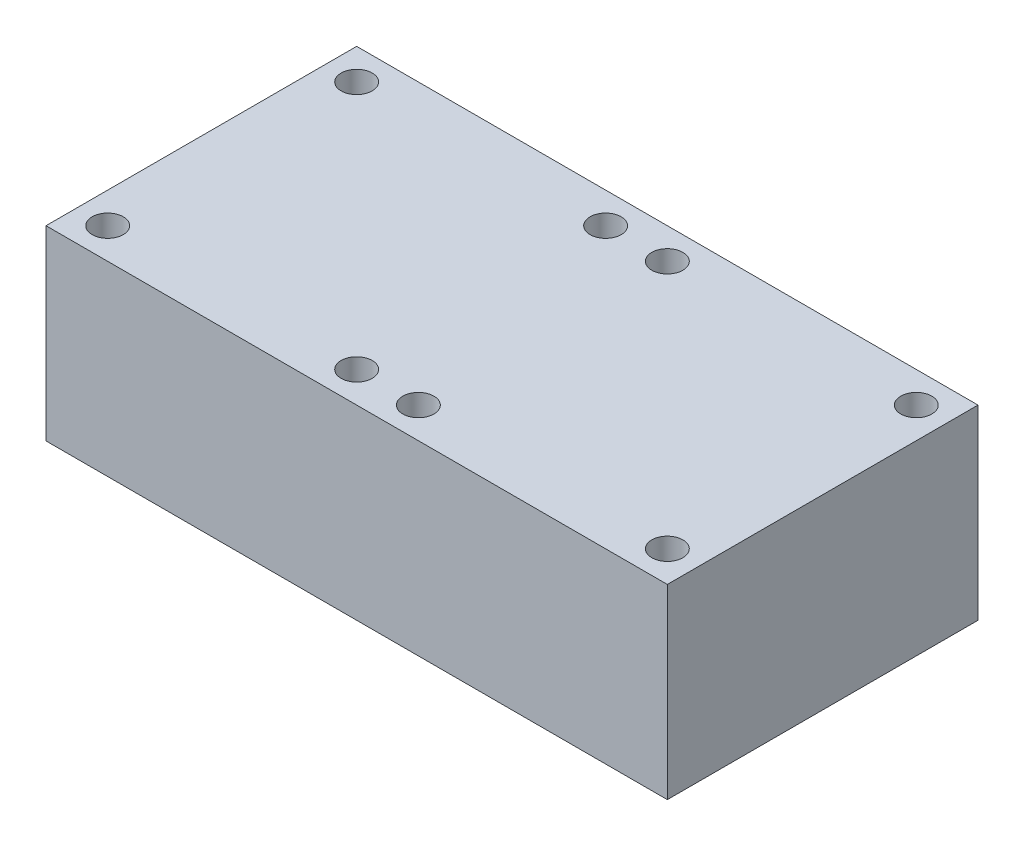
ISO-10303-21;
HEADER;
FILE_DESCRIPTION(('STEP AP214'),'2;1');
FILE_NAME('part.step','',(''),(''),'','','');
FILE_SCHEMA(('AUTOMOTIVE_DESIGN { 1 0 10303 214 1 1 1 1 }'));
ENDSEC;
DATA;
#1=APPLICATION_CONTEXT('core data for automotive mechanical design processes');
#2=APPLICATION_PROTOCOL_DEFINITION('international standard','automotive_design',2000,#1);
#3=PRODUCT_CONTEXT('',#1,'mechanical');
#4=PRODUCT('Part','Part','',(#3));
#5=PRODUCT_RELATED_PRODUCT_CATEGORY('part','',(#4));
#6=PRODUCT_DEFINITION_FORMATION('','',#4);
#7=PRODUCT_DEFINITION_CONTEXT('part definition',#1,'design');
#8=PRODUCT_DEFINITION('design','',#6,#7);
#9=PRODUCT_DEFINITION_SHAPE('','',#8);
#10=(LENGTH_UNIT() NAMED_UNIT(*) SI_UNIT(.MILLI.,.METRE.));
#11=(NAMED_UNIT(*) PLANE_ANGLE_UNIT() SI_UNIT($,.RADIAN.));
#12=(NAMED_UNIT(*) SI_UNIT($,.STERADIAN.) SOLID_ANGLE_UNIT());
#13=UNCERTAINTY_MEASURE_WITH_UNIT(LENGTH_MEASURE(1.E-05),#10,'distance_accuracy_value','');
#14=(GEOMETRIC_REPRESENTATION_CONTEXT(3) GLOBAL_UNCERTAINTY_ASSIGNED_CONTEXT((#13)) GLOBAL_UNIT_ASSIGNED_CONTEXT((#10,
#11,#12)) REPRESENTATION_CONTEXT('',''));
#15=CARTESIAN_POINT('',(0.,0.,0.));
#16=DIRECTION('',(0.,0.,1.));
#17=DIRECTION('',(1.,0.,0.));
#18=AXIS2_PLACEMENT_3D('',#15,#16,#17);
#19=CARTESIAN_POINT('',(30.,-15.,30.));
#20=DIRECTION('',(-1.,0.,0.));
#21=DIRECTION('',(0.,0.,1.));
#22=AXIS2_PLACEMENT_3D('',#19,#20,#21);
#23=PLANE('',#22);
#24=DIRECTION('',(0.,0.,1.));
#25=VECTOR('',#24,1.);
#26=CARTESIAN_POINT('',(30.,-3.,0.));
#27=LINE('',#26,#25);
#28=CARTESIAN_POINT('',(30.,-3.,0.));
#29=VERTEX_POINT('',#28);
#30=CARTESIAN_POINT('',(30.,-3.,30.));
#31=VERTEX_POINT('',#30);
#32=EDGE_CURVE('E97',#29,#31,#27,.T.);
#33=ORIENTED_EDGE('',*,*,#32,.F.);
#34=DIRECTION('',(0.,1.,0.));
#35=VECTOR('',#34,1.);
#36=CARTESIAN_POINT('',(30.,-15.,0.));
#37=LINE('',#36,#35);
#38=CARTESIAN_POINT('',(30.,15.,0.));
#39=VERTEX_POINT('',#38);
#40=EDGE_CURVE('E80',#29,#39,#37,.T.);
#41=ORIENTED_EDGE('',*,*,#40,.T.);
#42=DIRECTION('',(0.,0.,-1.));
#43=VECTOR('',#42,1.);
#44=CARTESIAN_POINT('',(30.,15.,30.));
#45=LINE('',#44,#43);
#46=CARTESIAN_POINT('',(30.,15.,30.));
#47=VERTEX_POINT('',#46);
#48=EDGE_CURVE('E11',#47,#39,#45,.T.);
#49=ORIENTED_EDGE('',*,*,#48,.F.);
#50=DIRECTION('',(0.,1.,0.));
#51=VECTOR('',#50,1.);
#52=CARTESIAN_POINT('',(30.,-15.,30.));
#53=LINE('',#52,#51);
#54=EDGE_CURVE('E88',#31,#47,#53,.T.);
#55=ORIENTED_EDGE('',*,*,#54,.F.);
#56=EDGE_LOOP('',(#33,#41,#49,#55));
#57=FACE_BOUND('',#56,.T.);
#58=ADVANCED_FACE('F36',(#57),#23,.F.);
#59=CARTESIAN_POINT('',(-30.,-15.,30.));
#60=DIRECTION('',(1.,0.,0.));
#61=DIRECTION('',(0.,0.,-1.));
#62=AXIS2_PLACEMENT_3D('',#59,#60,#61);
#63=PLANE('',#62);
#64=DIRECTION('',(0.,0.,-1.));
#65=VECTOR('',#64,1.);
#66=CARTESIAN_POINT('',(-30.,-3.,30.));
#67=LINE('',#66,#65);
#68=CARTESIAN_POINT('',(-30.,-3.,30.));
#69=VERTEX_POINT('',#68);
#70=CARTESIAN_POINT('',(-30.,-3.,0.));
#71=VERTEX_POINT('',#70);
#72=EDGE_CURVE('E50',#69,#71,#67,.T.);
#73=ORIENTED_EDGE('',*,*,#72,.F.);
#74=DIRECTION('',(0.,-1.,0.));
#75=VECTOR('',#74,1.);
#76=CARTESIAN_POINT('',(-30.,-15.,30.));
#77=LINE('',#76,#75);
#78=CARTESIAN_POINT('',(-30.,15.,30.));
#79=VERTEX_POINT('',#78);
#80=EDGE_CURVE('E85',#79,#69,#77,.T.);
#81=ORIENTED_EDGE('',*,*,#80,.F.);
#82=DIRECTION('',(0.,0.,-1.));
#83=VECTOR('',#82,1.);
#84=CARTESIAN_POINT('',(-30.,15.,30.));
#85=LINE('',#84,#83);
#86=CARTESIAN_POINT('',(-30.,15.,0.));
#87=VERTEX_POINT('',#86);
#88=EDGE_CURVE('E43',#79,#87,#85,.T.);
#89=ORIENTED_EDGE('',*,*,#88,.T.);
#90=DIRECTION('',(0.,-1.,0.));
#91=VECTOR('',#90,1.);
#92=CARTESIAN_POINT('',(-30.,-15.,0.));
#93=LINE('',#92,#91);
#94=EDGE_CURVE('E79',#87,#71,#93,.T.);
#95=ORIENTED_EDGE('',*,*,#94,.T.);
#96=EDGE_LOOP('',(#73,#81,#89,#95));
#97=FACE_BOUND('',#96,.T.);
#98=ADVANCED_FACE('F84',(#97),#63,.F.);
#99=CARTESIAN_POINT('',(0.,0.,30.));
#100=DIRECTION('',(0.,0.,-1.));
#101=DIRECTION('',(-1.,0.,0.));
#102=AXIS2_PLACEMENT_3D('',#99,#100,#101);
#103=PLANE('',#102);
#104=DIRECTION('',(-1.,0.,0.));
#105=VECTOR('',#104,1.);
#106=CARTESIAN_POINT('',(30.,-3.,30.));
#107=LINE('',#106,#105);
#108=EDGE_CURVE('E93',#31,#69,#107,.T.);
#109=ORIENTED_EDGE('',*,*,#108,.F.);
#110=ORIENTED_EDGE('',*,*,#54,.T.);
#111=DIRECTION('',(-1.,0.,0.));
#112=VECTOR('',#111,1.);
#113=CARTESIAN_POINT('',(-30.,15.,30.));
#114=LINE('',#113,#112);
#115=EDGE_CURVE('E59',#47,#79,#114,.T.);
#116=ORIENTED_EDGE('',*,*,#115,.T.);
#117=ORIENTED_EDGE('',*,*,#80,.T.);
#118=EDGE_LOOP('',(#109,#110,#116,#117));
#119=FACE_BOUND('',#118,.T.);
#120=ADVANCED_FACE('F191',(#119),#103,.F.);
#121=CARTESIAN_POINT('',(0.,0.,0.));
#122=DIRECTION('',(0.,0.,-1.));
#123=DIRECTION('',(-1.,0.,0.));
#124=AXIS2_PLACEMENT_3D('',#121,#122,#123);
#125=PLANE('',#124);
#126=ORIENTED_EDGE('',*,*,#40,.F.);
#127=DIRECTION('',(1.,0.,0.));
#128=VECTOR('',#127,1.);
#129=CARTESIAN_POINT('',(-30.,-3.,0.));
#130=LINE('',#129,#128);
#131=EDGE_CURVE('E87',#71,#29,#130,.T.);
#132=ORIENTED_EDGE('',*,*,#131,.F.);
#133=ORIENTED_EDGE('',*,*,#94,.F.);
#134=DIRECTION('',(-1.,0.,0.));
#135=VECTOR('',#134,1.);
#136=CARTESIAN_POINT('',(-30.,15.,0.));
#137=LINE('',#136,#135);
#138=EDGE_CURVE('E71',#39,#87,#137,.T.);
#139=ORIENTED_EDGE('',*,*,#138,.F.);
#140=EDGE_LOOP('',(#126,#132,#133,#139));
#141=FACE_BOUND('',#140,.T.);
#142=ADVANCED_FACE('F86',(#141),#125,.T.);
#143=CARTESIAN_POINT('',(-30.,15.,30.));
#144=DIRECTION('',(0.,-1.,0.));
#145=DIRECTION('',(0.,0.,-1.));
#146=AXIS2_PLACEMENT_3D('',#143,#144,#145);
#147=PLANE('',#146);
#148=CARTESIAN_POINT('',(27.0208152801713,15.,27.0208152801713));
#149=DIRECTION('',(0.,1.,0.));
#150=DIRECTION('',(0.,0.,-1.));
#151=AXIS2_PLACEMENT_3D('',#148,#149,#150);
#152=CIRCLE('',#151,1.5);
#153=CARTESIAN_POINT('',(27.0208152801713,15.,25.5208152801713));
#154=VERTEX_POINT('',#153);
#155=EDGE_CURVE('E121',#154,#154,#152,.T.);
#156=ORIENTED_EDGE('',*,*,#155,.F.);
#157=EDGE_LOOP('',(#156));
#158=FACE_BOUND('',#157,.T.);
#159=CARTESIAN_POINT('',(-27.0208152801713,15.,27.0208152801713));
#160=DIRECTION('',(0.,1.,0.));
#161=DIRECTION('',(0.,0.,1.));
#162=AXIS2_PLACEMENT_3D('',#159,#160,#161);
#163=CIRCLE('',#162,1.5);
#164=CARTESIAN_POINT('',(-27.0208152801713,15.,28.5208152801713));
#165=VERTEX_POINT('',#164);
#166=EDGE_CURVE('E128',#165,#165,#163,.T.);
#167=ORIENTED_EDGE('',*,*,#166,.F.);
#168=EDGE_LOOP('',(#167));
#169=FACE_BOUND('',#168,.T.);
#170=CARTESIAN_POINT('',(-2.97918471982869,15.,27.0208152801713));
#171=DIRECTION('',(0.,1.,0.));
#172=DIRECTION('',(0.,0.,1.));
#173=AXIS2_PLACEMENT_3D('',#170,#171,#172);
#174=CIRCLE('',#173,1.5);
#175=CARTESIAN_POINT('',(-2.97918471982869,15.,28.5208152801713));
#176=VERTEX_POINT('',#175);
#177=EDGE_CURVE('E109',#176,#176,#174,.T.);
#178=ORIENTED_EDGE('',*,*,#177,.F.);
#179=EDGE_LOOP('',(#178));
#180=FACE_BOUND('',#179,.T.);
#181=CARTESIAN_POINT('',(-2.97918471982869,15.,2.97918471982869));
#182=DIRECTION('',(0.,1.,0.));
#183=DIRECTION('',(0.,0.,1.));
#184=AXIS2_PLACEMENT_3D('',#181,#182,#183);
#185=CIRCLE('',#184,1.5);
#186=CARTESIAN_POINT('',(-2.97918471982869,15.,4.47918471982869));
#187=VERTEX_POINT('',#186);
#188=EDGE_CURVE('E116',#187,#187,#185,.T.);
#189=ORIENTED_EDGE('',*,*,#188,.F.);
#190=EDGE_LOOP('',(#189));
#191=FACE_BOUND('',#190,.T.);
#192=CARTESIAN_POINT('',(2.97918471982869,15.,27.0208152801713));
#193=DIRECTION('',(0.,1.,0.));
#194=DIRECTION('',(0.,0.,-1.));
#195=AXIS2_PLACEMENT_3D('',#192,#193,#194);
#196=CIRCLE('',#195,1.5);
#197=CARTESIAN_POINT('',(2.97918471982869,15.,25.5208152801713));
#198=VERTEX_POINT('',#197);
#199=EDGE_CURVE('E145',#198,#198,#196,.T.);
#200=ORIENTED_EDGE('',*,*,#199,.F.);
#201=EDGE_LOOP('',(#200));
#202=FACE_BOUND('',#201,.T.);
#203=CARTESIAN_POINT('',(2.97918471982869,15.,2.97918471982869));
#204=DIRECTION('',(0.,1.,0.));
#205=DIRECTION('',(0.,0.,-1.));
#206=AXIS2_PLACEMENT_3D('',#203,#204,#205);
#207=CIRCLE('',#206,1.5);
#208=CARTESIAN_POINT('',(2.97918471982869,15.,1.47918471982869));
#209=VERTEX_POINT('',#208);
#210=EDGE_CURVE('E139',#209,#209,#207,.T.);
#211=ORIENTED_EDGE('',*,*,#210,.F.);
#212=EDGE_LOOP('',(#211));
#213=FACE_BOUND('',#212,.T.);
#214=CARTESIAN_POINT('',(27.0208152801713,15.,2.97918471982869));
#215=DIRECTION('',(0.,1.,0.));
#216=DIRECTION('',(0.,0.,-1.));
#217=AXIS2_PLACEMENT_3D('',#214,#215,#216);
#218=CIRCLE('',#217,1.5);
#219=CARTESIAN_POINT('',(27.0208152801713,15.,1.47918471982869));
#220=VERTEX_POINT('',#219);
#221=EDGE_CURVE('E133',#220,#220,#218,.T.);
#222=ORIENTED_EDGE('',*,*,#221,.F.);
#223=EDGE_LOOP('',(#222));
#224=FACE_BOUND('',#223,.T.);
#225=CARTESIAN_POINT('',(-27.0208152801713,15.,2.97918471982869));
#226=DIRECTION('',(0.,1.,0.));
#227=DIRECTION('',(0.,0.,1.));
#228=AXIS2_PLACEMENT_3D('',#225,#226,#227);
#229=CIRCLE('',#228,1.5);
#230=CARTESIAN_POINT('',(-27.0208152801713,15.,4.47918471982869));
#231=VERTEX_POINT('',#230);
#232=EDGE_CURVE('E103',#231,#231,#229,.T.);
#233=ORIENTED_EDGE('',*,*,#232,.F.);
#234=EDGE_LOOP('',(#233));
#235=FACE_BOUND('',#234,.T.);
#236=ORIENTED_EDGE('',*,*,#138,.T.);
#237=ORIENTED_EDGE('',*,*,#88,.F.);
#238=ORIENTED_EDGE('',*,*,#115,.F.);
#239=ORIENTED_EDGE('',*,*,#48,.T.);
#240=EDGE_LOOP('',(#236,#237,#238,#239));
#241=FACE_BOUND('',#240,.T.);
#242=ADVANCED_FACE('F73',(#158,#169,#180,#191,#202,#213,#224,#235,#241),#147,.F.);
#243=CARTESIAN_POINT('',(0.,-3.,0.));
#244=DIRECTION('',(0.,-1.,0.));
#245=DIRECTION('',(0.,0.,-1.));
#246=AXIS2_PLACEMENT_3D('',#243,#244,#245);
#247=PLANE('',#246);
#248=CARTESIAN_POINT('',(27.0208152801713,-3.,27.0208152801713));
#249=DIRECTION('',(0.,1.,0.));
#250=DIRECTION('',(0.,0.,-1.));
#251=AXIS2_PLACEMENT_3D('',#248,#249,#250);
#252=CIRCLE('',#251,1.5);
#253=CARTESIAN_POINT('',(27.0208152801713,-3.,25.5208152801713));
#254=VERTEX_POINT('',#253);
#255=EDGE_CURVE('E124',#254,#254,#252,.T.);
#256=ORIENTED_EDGE('',*,*,#255,.T.);
#257=EDGE_LOOP('',(#256));
#258=FACE_BOUND('',#257,.T.);
#259=CARTESIAN_POINT('',(-27.0208152801713,-3.,27.0208152801713));
#260=DIRECTION('',(0.,1.,0.));
#261=DIRECTION('',(0.,0.,1.));
#262=AXIS2_PLACEMENT_3D('',#259,#260,#261);
#263=CIRCLE('',#262,1.5);
#264=CARTESIAN_POINT('',(-27.0208152801713,-3.,28.5208152801713));
#265=VERTEX_POINT('',#264);
#266=EDGE_CURVE('E113',#265,#265,#263,.T.);
#267=ORIENTED_EDGE('',*,*,#266,.T.);
#268=EDGE_LOOP('',(#267));
#269=FACE_BOUND('',#268,.T.);
#270=CARTESIAN_POINT('',(-2.97918471982869,-3.,27.0208152801713));
#271=DIRECTION('',(0.,1.,0.));
#272=DIRECTION('',(0.,0.,1.));
#273=AXIS2_PLACEMENT_3D('',#270,#271,#272);
#274=CIRCLE('',#273,1.5);
#275=CARTESIAN_POINT('',(-2.97918471982869,-3.,28.5208152801713));
#276=VERTEX_POINT('',#275);
#277=EDGE_CURVE('E112',#276,#276,#274,.T.);
#278=ORIENTED_EDGE('',*,*,#277,.T.);
#279=EDGE_LOOP('',(#278));
#280=FACE_BOUND('',#279,.T.);
#281=CARTESIAN_POINT('',(-2.97918471982869,-3.,2.97918471982869));
#282=DIRECTION('',(0.,1.,0.));
#283=DIRECTION('',(0.,0.,1.));
#284=AXIS2_PLACEMENT_3D('',#281,#282,#283);
#285=CIRCLE('',#284,1.5);
#286=CARTESIAN_POINT('',(-2.97918471982869,-3.,4.47918471982869));
#287=VERTEX_POINT('',#286);
#288=EDGE_CURVE('E106',#287,#287,#285,.T.);
#289=ORIENTED_EDGE('',*,*,#288,.T.);
#290=EDGE_LOOP('',(#289));
#291=FACE_BOUND('',#290,.T.);
#292=CARTESIAN_POINT('',(2.97918471982869,-3.,27.0208152801713));
#293=DIRECTION('',(0.,1.,0.));
#294=DIRECTION('',(0.,0.,-1.));
#295=AXIS2_PLACEMENT_3D('',#292,#293,#294);
#296=CIRCLE('',#295,1.5);
#297=CARTESIAN_POINT('',(2.97918471982869,-3.,25.5208152801713));
#298=VERTEX_POINT('',#297);
#299=EDGE_CURVE('E125',#298,#298,#296,.T.);
#300=ORIENTED_EDGE('',*,*,#299,.T.);
#301=EDGE_LOOP('',(#300));
#302=FACE_BOUND('',#301,.T.);
#303=CARTESIAN_POINT('',(2.97918471982869,-3.,2.97918471982869));
#304=DIRECTION('',(0.,1.,0.));
#305=DIRECTION('',(0.,0.,-1.));
#306=AXIS2_PLACEMENT_3D('',#303,#304,#305);
#307=CIRCLE('',#306,1.5);
#308=CARTESIAN_POINT('',(2.97918471982869,-3.,1.47918471982869));
#309=VERTEX_POINT('',#308);
#310=EDGE_CURVE('E142',#309,#309,#307,.T.);
#311=ORIENTED_EDGE('',*,*,#310,.T.);
#312=EDGE_LOOP('',(#311));
#313=FACE_BOUND('',#312,.T.);
#314=CARTESIAN_POINT('',(27.0208152801713,-3.,2.97918471982869));
#315=DIRECTION('',(0.,1.,0.));
#316=DIRECTION('',(0.,0.,-1.));
#317=AXIS2_PLACEMENT_3D('',#314,#315,#316);
#318=CIRCLE('',#317,1.5);
#319=CARTESIAN_POINT('',(27.0208152801713,-3.,1.47918471982869));
#320=VERTEX_POINT('',#319);
#321=EDGE_CURVE('E136',#320,#320,#318,.T.);
#322=ORIENTED_EDGE('',*,*,#321,.T.);
#323=EDGE_LOOP('',(#322));
#324=FACE_BOUND('',#323,.T.);
#325=CARTESIAN_POINT('',(-27.0208152801713,-3.,2.97918471982869));
#326=DIRECTION('',(0.,1.,0.));
#327=DIRECTION('',(0.,0.,1.));
#328=AXIS2_PLACEMENT_3D('',#325,#326,#327);
#329=CIRCLE('',#328,1.5);
#330=CARTESIAN_POINT('',(-27.0208152801713,-3.,4.47918471982869));
#331=VERTEX_POINT('',#330);
#332=EDGE_CURVE('E102',#331,#331,#329,.T.);
#333=ORIENTED_EDGE('',*,*,#332,.T.);
#334=EDGE_LOOP('',(#333));
#335=FACE_BOUND('',#334,.T.);
#336=ORIENTED_EDGE('',*,*,#72,.T.);
#337=ORIENTED_EDGE('',*,*,#131,.T.);
#338=ORIENTED_EDGE('',*,*,#32,.T.);
#339=ORIENTED_EDGE('',*,*,#108,.T.);
#340=EDGE_LOOP('',(#336,#337,#338,#339));
#341=FACE_BOUND('',#340,.T.);
#342=ADVANCED_FACE('F151',(#258,#269,#280,#291,#302,#313,#324,#335,#341),#247,.T.);
#343=CARTESIAN_POINT('',(-27.0208152801713,-3.,2.97918471982869));
#344=DIRECTION('',(0.,1.,0.));
#345=DIRECTION('',(0.,0.,1.));
#346=AXIS2_PLACEMENT_3D('',#343,#344,#345);
#347=CYLINDRICAL_SURFACE('',#346,1.5);
#348=ORIENTED_EDGE('',*,*,#332,.F.);
#349=EDGE_LOOP('',(#348));
#350=FACE_BOUND('',#349,.T.);
#351=ORIENTED_EDGE('',*,*,#232,.T.);
#352=EDGE_LOOP('',(#351));
#353=FACE_BOUND('',#352,.T.);
#354=ADVANCED_FACE('F171',(#350,#353),#347,.F.);
#355=CARTESIAN_POINT('',(27.0208152801713,-3.,2.97918471982869));
#356=DIRECTION('',(0.,1.,0.));
#357=DIRECTION('',(0.,0.,1.));
#358=AXIS2_PLACEMENT_3D('',#355,#356,#357);
#359=CYLINDRICAL_SURFACE('',#358,1.5);
#360=ORIENTED_EDGE('',*,*,#321,.F.);
#361=EDGE_LOOP('',(#360));
#362=FACE_BOUND('',#361,.T.);
#363=ORIENTED_EDGE('',*,*,#221,.T.);
#364=EDGE_LOOP('',(#363));
#365=FACE_BOUND('',#364,.T.);
#366=ADVANCED_FACE('F173',(#362,#365),#359,.F.);
#367=CARTESIAN_POINT('',(2.97918471982869,-3.,2.97918471982869));
#368=DIRECTION('',(0.,1.,0.));
#369=DIRECTION('',(0.,0.,1.));
#370=AXIS2_PLACEMENT_3D('',#367,#368,#369);
#371=CYLINDRICAL_SURFACE('',#370,1.5);
#372=ORIENTED_EDGE('',*,*,#310,.F.);
#373=EDGE_LOOP('',(#372));
#374=FACE_BOUND('',#373,.T.);
#375=ORIENTED_EDGE('',*,*,#210,.T.);
#376=EDGE_LOOP('',(#375));
#377=FACE_BOUND('',#376,.T.);
#378=ADVANCED_FACE('F158',(#374,#377),#371,.F.);
#379=CARTESIAN_POINT('',(2.97918471982869,-3.,27.0208152801713));
#380=DIRECTION('',(0.,1.,0.));
#381=DIRECTION('',(0.,0.,1.));
#382=AXIS2_PLACEMENT_3D('',#379,#380,#381);
#383=CYLINDRICAL_SURFACE('',#382,1.5);
#384=ORIENTED_EDGE('',*,*,#299,.F.);
#385=EDGE_LOOP('',(#384));
#386=FACE_BOUND('',#385,.T.);
#387=ORIENTED_EDGE('',*,*,#199,.T.);
#388=EDGE_LOOP('',(#387));
#389=FACE_BOUND('',#388,.T.);
#390=ADVANCED_FACE('F154',(#386,#389),#383,.F.);
#391=CARTESIAN_POINT('',(-2.97918471982869,-3.,2.97918471982869));
#392=DIRECTION('',(0.,1.,0.));
#393=DIRECTION('',(0.,0.,1.));
#394=AXIS2_PLACEMENT_3D('',#391,#392,#393);
#395=CYLINDRICAL_SURFACE('',#394,1.5);
#396=ORIENTED_EDGE('',*,*,#288,.F.);
#397=EDGE_LOOP('',(#396));
#398=FACE_BOUND('',#397,.T.);
#399=ORIENTED_EDGE('',*,*,#188,.T.);
#400=EDGE_LOOP('',(#399));
#401=FACE_BOUND('',#400,.T.);
#402=ADVANCED_FACE('F157',(#398,#401),#395,.F.);
#403=CARTESIAN_POINT('',(-2.97918471982869,-3.,27.0208152801713));
#404=DIRECTION('',(0.,1.,0.));
#405=DIRECTION('',(0.,0.,1.));
#406=AXIS2_PLACEMENT_3D('',#403,#404,#405);
#407=CYLINDRICAL_SURFACE('',#406,1.5);
#408=ORIENTED_EDGE('',*,*,#277,.F.);
#409=EDGE_LOOP('',(#408));
#410=FACE_BOUND('',#409,.T.);
#411=ORIENTED_EDGE('',*,*,#177,.T.);
#412=EDGE_LOOP('',(#411));
#413=FACE_BOUND('',#412,.T.);
#414=ADVANCED_FACE('F251',(#410,#413),#407,.F.);
#415=CARTESIAN_POINT('',(-27.0208152801713,-3.,27.0208152801713));
#416=DIRECTION('',(0.,1.,0.));
#417=DIRECTION('',(0.,0.,1.));
#418=AXIS2_PLACEMENT_3D('',#415,#416,#417);
#419=CYLINDRICAL_SURFACE('',#418,1.5);
#420=ORIENTED_EDGE('',*,*,#266,.F.);
#421=EDGE_LOOP('',(#420));
#422=FACE_BOUND('',#421,.T.);
#423=ORIENTED_EDGE('',*,*,#166,.T.);
#424=EDGE_LOOP('',(#423));
#425=FACE_BOUND('',#424,.T.);
#426=ADVANCED_FACE('F261',(#422,#425),#419,.F.);
#427=CARTESIAN_POINT('',(27.0208152801713,-3.,27.0208152801713));
#428=DIRECTION('',(0.,1.,0.));
#429=DIRECTION('',(0.,0.,1.));
#430=AXIS2_PLACEMENT_3D('',#427,#428,#429);
#431=CYLINDRICAL_SURFACE('',#430,1.5);
#432=ORIENTED_EDGE('',*,*,#255,.F.);
#433=EDGE_LOOP('',(#432));
#434=FACE_BOUND('',#433,.T.);
#435=ORIENTED_EDGE('',*,*,#155,.T.);
#436=EDGE_LOOP('',(#435));
#437=FACE_BOUND('',#436,.T.);
#438=ADVANCED_FACE('F270',(#434,#437),#431,.F.);
#439=CLOSED_SHELL('',(#58,#98,#120,#142,#242,#342,#354,#366,#378,#390,#402,#414,#426,#438));
#440=MANIFOLD_SOLID_BREP('B2',#439);
#441=ADVANCED_BREP_SHAPE_REPRESENTATION('',(#18,#440),#14);
#442=SHAPE_DEFINITION_REPRESENTATION(#9,#441);
ENDSEC;
END-ISO-10303-21;
